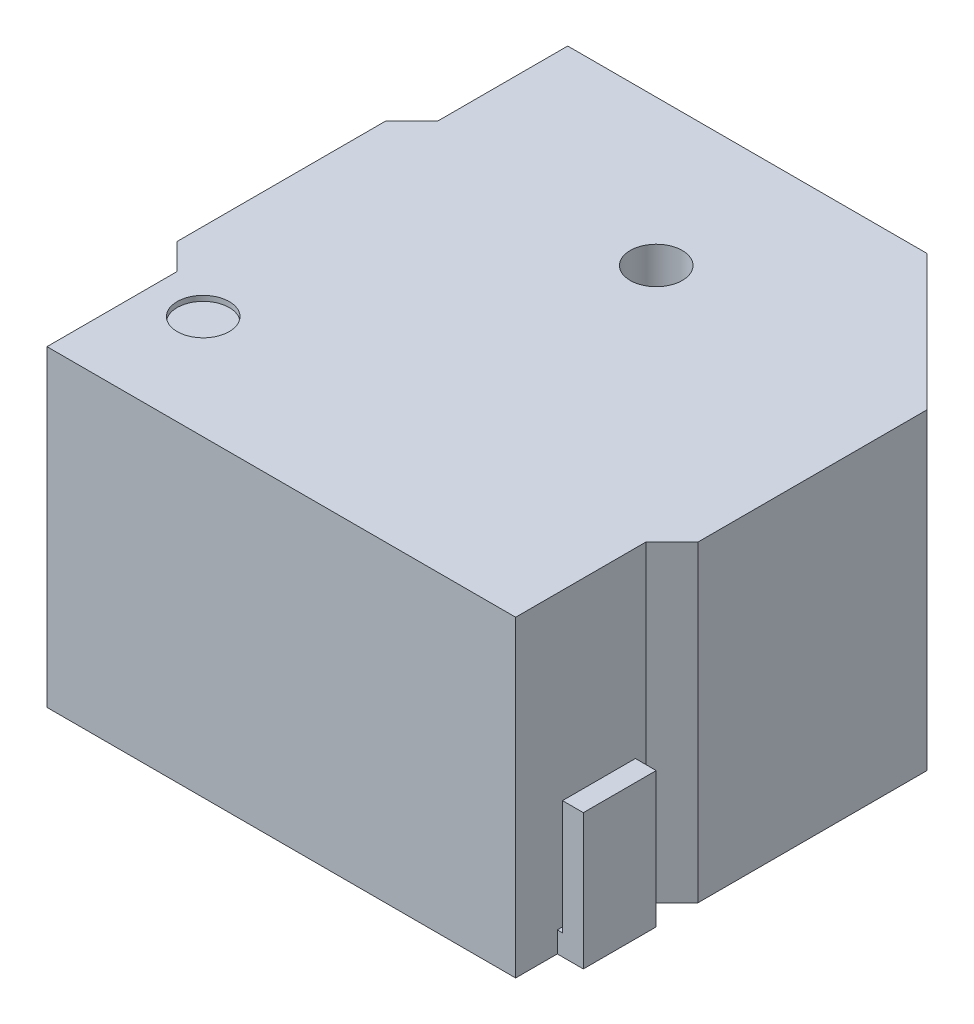
ISO-10303-21;
HEADER;
FILE_DESCRIPTION(('STEP AP214'),'2;1');
FILE_NAME('part.step','',(''),(''),'','','');
FILE_SCHEMA(('AUTOMOTIVE_DESIGN { 1 0 10303 214 1 1 1 1 }'));
ENDSEC;
DATA;
#1=APPLICATION_CONTEXT('core data for automotive mechanical design processes');
#2=APPLICATION_PROTOCOL_DEFINITION('international standard','automotive_design',2000,#1);
#3=PRODUCT_CONTEXT('',#1,'mechanical');
#4=PRODUCT('Part','Part','',(#3));
#5=PRODUCT_RELATED_PRODUCT_CATEGORY('part','',(#4));
#6=PRODUCT_DEFINITION_FORMATION('','',#4);
#7=PRODUCT_DEFINITION_CONTEXT('part definition',#1,'design');
#8=PRODUCT_DEFINITION('design','',#6,#7);
#9=PRODUCT_DEFINITION_SHAPE('','',#8);
#10=(LENGTH_UNIT() NAMED_UNIT(*) SI_UNIT(.MILLI.,.METRE.));
#11=(NAMED_UNIT(*) PLANE_ANGLE_UNIT() SI_UNIT($,.RADIAN.));
#12=(NAMED_UNIT(*) SI_UNIT($,.STERADIAN.) SOLID_ANGLE_UNIT());
#13=UNCERTAINTY_MEASURE_WITH_UNIT(LENGTH_MEASURE(1.E-05),#10,'distance_accuracy_value','');
#14=(GEOMETRIC_REPRESENTATION_CONTEXT(3) GLOBAL_UNCERTAINTY_ASSIGNED_CONTEXT((#13)) GLOBAL_UNIT_ASSIGNED_CONTEXT((#10,
#11,#12)) REPRESENTATION_CONTEXT('',''));
#15=CARTESIAN_POINT('',(0.,0.,0.));
#16=DIRECTION('',(0.,0.,1.));
#17=DIRECTION('',(1.,0.,0.));
#18=AXIS2_PLACEMENT_3D('',#15,#16,#17);
#19=CARTESIAN_POINT('',(0.,0.2,0.));
#20=DIRECTION('',(0.,-1.,0.));
#21=DIRECTION('',(0.,0.,-1.));
#22=AXIS2_PLACEMENT_3D('',#19,#20,#21);
#23=PLANE('',#22);
#24=DIRECTION('',(0.,0.,1.));
#25=VECTOR('',#24,1.);
#26=CARTESIAN_POINT('',(2.3,0.2,1.4));
#27=LINE('',#26,#25);
#28=CARTESIAN_POINT('',(2.3,0.2,1.4));
#29=VERTEX_POINT('',#28);
#30=CARTESIAN_POINT('',(2.3,0.2,2.1));
#31=VERTEX_POINT('',#30);
#32=EDGE_CURVE('E266',#29,#31,#27,.T.);
#33=ORIENTED_EDGE('',*,*,#32,.F.);
#34=DIRECTION('',(1.,0.,0.));
#35=VECTOR('',#34,1.);
#36=CARTESIAN_POINT('',(1.4,0.2,1.4));
#37=LINE('',#36,#35);
#38=CARTESIAN_POINT('',(2.25,0.2,1.4));
#39=VERTEX_POINT('',#38);
#40=EDGE_CURVE('E310',#39,#29,#37,.T.);
#41=ORIENTED_EDGE('',*,*,#40,.F.);
#42=DIRECTION('',(0.,0.,1.));
#43=VECTOR('',#42,1.);
#44=CARTESIAN_POINT('',(2.25,0.2,2.5));
#45=LINE('',#44,#43);
#46=CARTESIAN_POINT('',(2.25,0.2,2.1));
#47=VERTEX_POINT('',#46);
#48=EDGE_CURVE('E453',#39,#47,#45,.T.);
#49=ORIENTED_EDGE('',*,*,#48,.T.);
#50=DIRECTION('',(-1.,0.,0.));
#51=VECTOR('',#50,1.);
#52=CARTESIAN_POINT('',(2.5,0.2,2.1));
#53=LINE('',#52,#51);
#54=EDGE_CURVE('E316',#31,#47,#53,.T.);
#55=ORIENTED_EDGE('',*,*,#54,.F.);
#56=EDGE_LOOP('',(#33,#41,#49,#55));
#57=FACE_BOUND('',#56,.T.);
#58=ADVANCED_FACE('F34',(#57),#23,.F.);
#59=CARTESIAN_POINT('',(0.,0.2,0.));
#60=DIRECTION('',(0.,-1.,0.));
#61=DIRECTION('',(0.,0.,-1.));
#62=AXIS2_PLACEMENT_3D('',#59,#60,#61);
#63=PLANE('',#62);
#64=DIRECTION('',(0.,0.,-1.));
#65=VECTOR('',#64,1.);
#66=CARTESIAN_POINT('',(-2.3,0.2,1.4));
#67=LINE('',#66,#65);
#68=CARTESIAN_POINT('',(-2.3,0.2,2.1));
#69=VERTEX_POINT('',#68);
#70=CARTESIAN_POINT('',(-2.3,0.2,1.4));
#71=VERTEX_POINT('',#70);
#72=EDGE_CURVE('E276',#69,#71,#67,.T.);
#73=ORIENTED_EDGE('',*,*,#72,.F.);
#74=DIRECTION('',(-1.,0.,0.));
#75=VECTOR('',#74,1.);
#76=CARTESIAN_POINT('',(-1.4,0.2,2.1));
#77=LINE('',#76,#75);
#78=CARTESIAN_POINT('',(-2.25,0.2,2.1));
#79=VERTEX_POINT('',#78);
#80=EDGE_CURVE('E314',#79,#69,#77,.T.);
#81=ORIENTED_EDGE('',*,*,#80,.F.);
#82=DIRECTION('',(0.,0.,-1.));
#83=VECTOR('',#82,1.);
#84=CARTESIAN_POINT('',(-2.25,0.2,1.25));
#85=LINE('',#84,#83);
#86=CARTESIAN_POINT('',(-2.25,0.2,1.4));
#87=VERTEX_POINT('',#86);
#88=EDGE_CURVE('E154',#79,#87,#85,.T.);
#89=ORIENTED_EDGE('',*,*,#88,.T.);
#90=DIRECTION('',(1.,0.,0.));
#91=VECTOR('',#90,1.);
#92=CARTESIAN_POINT('',(-2.5,0.2,1.4));
#93=LINE('',#92,#91);
#94=EDGE_CURVE('E330',#71,#87,#93,.T.);
#95=ORIENTED_EDGE('',*,*,#94,.F.);
#96=EDGE_LOOP('',(#73,#81,#89,#95));
#97=FACE_BOUND('',#96,.T.);
#98=ADVANCED_FACE('F504',(#97),#63,.F.);
#99=CARTESIAN_POINT('',(0.,0.2,0.));
#100=DIRECTION('',(0.,-1.,0.));
#101=DIRECTION('',(0.,0.,-1.));
#102=AXIS2_PLACEMENT_3D('',#99,#100,#101);
#103=PLANE('',#102);
#104=DIRECTION('',(0.,0.,-1.));
#105=VECTOR('',#104,1.);
#106=CARTESIAN_POINT('',(-2.3,0.2,-2.1));
#107=LINE('',#106,#105);
#108=CARTESIAN_POINT('',(-2.3,0.2,-1.4));
#109=VERTEX_POINT('',#108);
#110=CARTESIAN_POINT('',(-2.3,0.2,-2.1));
#111=VERTEX_POINT('',#110);
#112=EDGE_CURVE('E293',#109,#111,#107,.T.);
#113=ORIENTED_EDGE('',*,*,#112,.F.);
#114=DIRECTION('',(-1.,0.,0.));
#115=VECTOR('',#114,1.);
#116=CARTESIAN_POINT('',(-1.4,0.2,-1.4));
#117=LINE('',#116,#115);
#118=CARTESIAN_POINT('',(-2.25,0.2,-1.4));
#119=VERTEX_POINT('',#118);
#120=EDGE_CURVE('E327',#119,#109,#117,.T.);
#121=ORIENTED_EDGE('',*,*,#120,.F.);
#122=DIRECTION('',(0.,0.,-1.));
#123=VECTOR('',#122,1.);
#124=CARTESIAN_POINT('',(-2.25,0.2,-2.5));
#125=LINE('',#124,#123);
#126=CARTESIAN_POINT('',(-2.25,0.2,-2.1));
#127=VERTEX_POINT('',#126);
#128=EDGE_CURVE('E437',#119,#127,#125,.T.);
#129=ORIENTED_EDGE('',*,*,#128,.T.);
#130=DIRECTION('',(1.,0.,0.));
#131=VECTOR('',#130,1.);
#132=CARTESIAN_POINT('',(-2.5,0.2,-2.1));
#133=LINE('',#132,#131);
#134=EDGE_CURVE('E343',#111,#127,#133,.T.);
#135=ORIENTED_EDGE('',*,*,#134,.F.);
#136=EDGE_LOOP('',(#113,#121,#129,#135));
#137=FACE_BOUND('',#136,.T.);
#138=ADVANCED_FACE('F510',(#137),#103,.F.);
#139=CARTESIAN_POINT('',(-1.,0.3,-1.75));
#140=DIRECTION('',(0.,-1.,0.));
#141=DIRECTION('',(0.,0.,-1.));
#142=AXIS2_PLACEMENT_3D('',#139,#140,#141);
#143=PLANE('',#142);
#144=CARTESIAN_POINT('',(-1.,0.3,-1.75));
#145=DIRECTION('',(0.,-1.,0.));
#146=DIRECTION('',(0.,0.,-1.));
#147=AXIS2_PLACEMENT_3D('',#144,#145,#146);
#148=CIRCLE('',#147,0.3);
#149=CARTESIAN_POINT('',(-1.,0.3,-2.05));
#150=VERTEX_POINT('',#149);
#151=EDGE_CURVE('E38',#150,#150,#148,.T.);
#152=ORIENTED_EDGE('',*,*,#151,.T.);
#153=EDGE_LOOP('',(#152));
#154=FACE_BOUND('',#153,.T.);
#155=ADVANCED_FACE('F36',(#154),#143,.T.);
#156=CARTESIAN_POINT('',(-1.,0.3,1.75));
#157=DIRECTION('',(0.,-1.,0.));
#158=DIRECTION('',(0.,0.,-1.));
#159=AXIS2_PLACEMENT_3D('',#156,#157,#158);
#160=PLANE('',#159);
#161=CARTESIAN_POINT('',(-1.,0.3,1.75));
#162=DIRECTION('',(0.,-1.,0.));
#163=DIRECTION('',(0.,0.,-1.));
#164=AXIS2_PLACEMENT_3D('',#161,#162,#163);
#165=CIRCLE('',#164,0.3);
#166=CARTESIAN_POINT('',(-1.,0.3,1.45));
#167=VERTEX_POINT('',#166);
#168=EDGE_CURVE('E479',#167,#167,#165,.T.);
#169=ORIENTED_EDGE('',*,*,#168,.T.);
#170=EDGE_LOOP('',(#169));
#171=FACE_BOUND('',#170,.T.);
#172=ADVANCED_FACE('F500',(#171),#160,.T.);
#173=CARTESIAN_POINT('',(1.,0.3,1.75));
#174=DIRECTION('',(0.,-1.,0.));
#175=DIRECTION('',(0.,0.,-1.));
#176=AXIS2_PLACEMENT_3D('',#173,#174,#175);
#177=PLANE('',#176);
#178=CARTESIAN_POINT('',(1.,0.3,1.75));
#179=DIRECTION('',(0.,-1.,0.));
#180=DIRECTION('',(0.,0.,-1.));
#181=AXIS2_PLACEMENT_3D('',#178,#179,#180);
#182=CIRCLE('',#181,0.3);
#183=CARTESIAN_POINT('',(1.,0.3,1.45));
#184=VERTEX_POINT('',#183);
#185=EDGE_CURVE('E463',#184,#184,#182,.T.);
#186=ORIENTED_EDGE('',*,*,#185,.T.);
#187=EDGE_LOOP('',(#186));
#188=FACE_BOUND('',#187,.T.);
#189=ADVANCED_FACE('F490',(#188),#177,.T.);
#190=CARTESIAN_POINT('',(-1.,0.3,-1.75));
#191=DIRECTION('',(0.,-1.,0.));
#192=DIRECTION('',(0.,0.,-1.));
#193=AXIS2_PLACEMENT_3D('',#190,#191,#192);
#194=CYLINDRICAL_SURFACE('',#193,0.3);
#195=CARTESIAN_POINT('',(-1.,0.,-1.75));
#196=DIRECTION('',(0.,-1.,0.));
#197=DIRECTION('',(0.,0.,-1.));
#198=AXIS2_PLACEMENT_3D('',#195,#196,#197);
#199=CIRCLE('',#198,0.3);
#200=CARTESIAN_POINT('',(-1.,0.,-2.05));
#201=VERTEX_POINT('',#200);
#202=EDGE_CURVE('E417',#201,#201,#199,.T.);
#203=ORIENTED_EDGE('',*,*,#202,.T.);
#204=EDGE_LOOP('',(#203));
#205=FACE_BOUND('',#204,.T.);
#206=ORIENTED_EDGE('',*,*,#151,.F.);
#207=EDGE_LOOP('',(#206));
#208=FACE_BOUND('',#207,.T.);
#209=ADVANCED_FACE('F487',(#205,#208),#194,.F.);
#210=CARTESIAN_POINT('',(-1.,0.3,1.75));
#211=DIRECTION('',(0.,-1.,0.));
#212=DIRECTION('',(0.,0.,-1.));
#213=AXIS2_PLACEMENT_3D('',#210,#211,#212);
#214=CYLINDRICAL_SURFACE('',#213,0.3);
#215=CARTESIAN_POINT('',(-1.,0.,1.75));
#216=DIRECTION('',(0.,-1.,0.));
#217=DIRECTION('',(0.,0.,-1.));
#218=AXIS2_PLACEMENT_3D('',#215,#216,#217);
#219=CIRCLE('',#218,0.3);
#220=CARTESIAN_POINT('',(-1.,0.,1.45));
#221=VERTEX_POINT('',#220);
#222=EDGE_CURVE('E473',#221,#221,#219,.T.);
#223=ORIENTED_EDGE('',*,*,#222,.T.);
#224=EDGE_LOOP('',(#223));
#225=FACE_BOUND('',#224,.T.);
#226=ORIENTED_EDGE('',*,*,#168,.F.);
#227=EDGE_LOOP('',(#226));
#228=FACE_BOUND('',#227,.T.);
#229=ADVANCED_FACE('F489',(#225,#228),#214,.F.);
#230=CARTESIAN_POINT('',(1.,0.3,1.75));
#231=DIRECTION('',(0.,-1.,0.));
#232=DIRECTION('',(0.,0.,-1.));
#233=AXIS2_PLACEMENT_3D('',#230,#231,#232);
#234=CYLINDRICAL_SURFACE('',#233,0.3);
#235=CARTESIAN_POINT('',(1.,0.,1.75));
#236=DIRECTION('',(0.,-1.,0.));
#237=DIRECTION('',(0.,0.,-1.));
#238=AXIS2_PLACEMENT_3D('',#235,#236,#237);
#239=CIRCLE('',#238,0.3);
#240=CARTESIAN_POINT('',(1.,0.,1.45));
#241=VERTEX_POINT('',#240);
#242=EDGE_CURVE('E414',#241,#241,#239,.T.);
#243=ORIENTED_EDGE('',*,*,#242,.T.);
#244=EDGE_LOOP('',(#243));
#245=FACE_BOUND('',#244,.T.);
#246=ORIENTED_EDGE('',*,*,#185,.F.);
#247=EDGE_LOOP('',(#246));
#248=FACE_BOUND('',#247,.T.);
#249=ADVANCED_FACE('F497',(#245,#248),#234,.F.);
#250=CARTESIAN_POINT('',(-2.25,3.,1.25));
#251=DIRECTION('',(1.,0.,0.));
#252=DIRECTION('',(0.,0.,-1.));
#253=AXIS2_PLACEMENT_3D('',#250,#251,#252);
#254=PLANE('',#253);
#255=DIRECTION('',(0.,0.,1.));
#256=VECTOR('',#255,1.);
#257=CARTESIAN_POINT('',(-2.25,0.,3.5));
#258=LINE('',#257,#256);
#259=CARTESIAN_POINT('',(-2.25,0.,2.1));
#260=VERTEX_POINT('',#259);
#261=CARTESIAN_POINT('',(-2.25,0.,2.5));
#262=VERTEX_POINT('',#261);
#263=EDGE_CURVE('E424',#260,#262,#258,.T.);
#264=ORIENTED_EDGE('',*,*,#263,.T.);
#265=DIRECTION('',(0.,1.,0.));
#266=VECTOR('',#265,1.);
#267=CARTESIAN_POINT('',(-2.25,3.,2.5));
#268=LINE('',#267,#266);
#269=CARTESIAN_POINT('',(-2.25,3.,2.5));
#270=VERTEX_POINT('',#269);
#271=EDGE_CURVE('E394',#262,#270,#268,.T.);
#272=ORIENTED_EDGE('',*,*,#271,.T.);
#273=DIRECTION('',(0.,0.,-1.));
#274=VECTOR('',#273,1.);
#275=CARTESIAN_POINT('',(-2.25,3.,1.25));
#276=LINE('',#275,#274);
#277=CARTESIAN_POINT('',(-2.25,3.,1.25));
#278=VERTEX_POINT('',#277);
#279=EDGE_CURVE('E458',#278,#270,#276,.F.);
#280=ORIENTED_EDGE('',*,*,#279,.F.);
#281=DIRECTION('',(0.,1.,0.));
#282=VECTOR('',#281,1.);
#283=CARTESIAN_POINT('',(-2.25,3.,1.25));
#284=LINE('',#283,#282);
#285=CARTESIAN_POINT('',(-2.25,0.,1.25));
#286=VERTEX_POINT('',#285);
#287=EDGE_CURVE('E400',#278,#286,#284,.F.);
#288=ORIENTED_EDGE('',*,*,#287,.T.);
#289=DIRECTION('',(0.,0.,1.));
#290=VECTOR('',#289,1.);
#291=CARTESIAN_POINT('',(-2.25,0.,3.5));
#292=LINE('',#291,#290);
#293=CARTESIAN_POINT('',(-2.25,0.,1.4));
#294=VERTEX_POINT('',#293);
#295=EDGE_CURVE('E426',#286,#294,#292,.T.);
#296=ORIENTED_EDGE('',*,*,#295,.T.);
#297=DIRECTION('',(0.,1.,0.));
#298=VECTOR('',#297,1.);
#299=CARTESIAN_POINT('',(-2.25,3.,1.4));
#300=LINE('',#299,#298);
#301=EDGE_CURVE('E460',#87,#294,#300,.F.);
#302=ORIENTED_EDGE('',*,*,#301,.F.);
#303=ORIENTED_EDGE('',*,*,#88,.F.);
#304=DIRECTION('',(0.,1.,0.));
#305=VECTOR('',#304,1.);
#306=CARTESIAN_POINT('',(-2.25,3.,2.1));
#307=LINE('',#306,#305);
#308=EDGE_CURVE('E456',#260,#79,#307,.T.);
#309=ORIENTED_EDGE('',*,*,#308,.F.);
#310=EDGE_LOOP('',(#264,#272,#280,#288,#296,#302,#303,#309));
#311=FACE_BOUND('',#310,.T.);
#312=ADVANCED_FACE('F613',(#311),#254,.F.);
#313=CARTESIAN_POINT('',(2.25,3.,2.5));
#314=DIRECTION('',(-1.,0.,0.));
#315=DIRECTION('',(0.,0.,1.));
#316=AXIS2_PLACEMENT_3D('',#313,#314,#315);
#317=PLANE('',#316);
#318=DIRECTION('',(0.,0.,1.));
#319=VECTOR('',#318,1.);
#320=CARTESIAN_POINT('',(2.25,0.,3.5));
#321=LINE('',#320,#319);
#322=CARTESIAN_POINT('',(2.25,0.,1.4));
#323=VERTEX_POINT('',#322);
#324=CARTESIAN_POINT('',(2.25,0.,1.25));
#325=VERTEX_POINT('',#324);
#326=EDGE_CURVE('E420',#323,#325,#321,.F.);
#327=ORIENTED_EDGE('',*,*,#326,.T.);
#328=DIRECTION('',(0.,1.,0.));
#329=VECTOR('',#328,1.);
#330=CARTESIAN_POINT('',(2.25,3.,1.25));
#331=LINE('',#330,#329);
#332=CARTESIAN_POINT('',(2.25,3.,1.25));
#333=VERTEX_POINT('',#332);
#334=EDGE_CURVE('E442',#325,#333,#331,.T.);
#335=ORIENTED_EDGE('',*,*,#334,.T.);
#336=DIRECTION('',(0.,0.,1.));
#337=VECTOR('',#336,1.);
#338=CARTESIAN_POINT('',(2.25,3.,2.5));
#339=LINE('',#338,#337);
#340=CARTESIAN_POINT('',(2.25,3.,2.5));
#341=VERTEX_POINT('',#340);
#342=EDGE_CURVE('E448',#341,#333,#339,.F.);
#343=ORIENTED_EDGE('',*,*,#342,.F.);
#344=DIRECTION('',(0.,1.,0.));
#345=VECTOR('',#344,1.);
#346=CARTESIAN_POINT('',(2.25,3.,2.5));
#347=LINE('',#346,#345);
#348=CARTESIAN_POINT('',(2.25,0.,2.5));
#349=VERTEX_POINT('',#348);
#350=EDGE_CURVE('E391',#341,#349,#347,.F.);
#351=ORIENTED_EDGE('',*,*,#350,.T.);
#352=DIRECTION('',(0.,0.,1.));
#353=VECTOR('',#352,1.);
#354=CARTESIAN_POINT('',(2.25,0.,3.5));
#355=LINE('',#354,#353);
#356=CARTESIAN_POINT('',(2.25,0.,2.1));
#357=VERTEX_POINT('',#356);
#358=EDGE_CURVE('E422',#349,#357,#355,.F.);
#359=ORIENTED_EDGE('',*,*,#358,.T.);
#360=DIRECTION('',(0.,1.,0.));
#361=VECTOR('',#360,1.);
#362=CARTESIAN_POINT('',(2.25,3.,2.1));
#363=LINE('',#362,#361);
#364=EDGE_CURVE('E450',#47,#357,#363,.F.);
#365=ORIENTED_EDGE('',*,*,#364,.F.);
#366=ORIENTED_EDGE('',*,*,#48,.F.);
#367=DIRECTION('',(0.,1.,0.));
#368=VECTOR('',#367,1.);
#369=CARTESIAN_POINT('',(2.25,3.,1.4));
#370=LINE('',#369,#368);
#371=EDGE_CURVE('E445',#323,#39,#370,.T.);
#372=ORIENTED_EDGE('',*,*,#371,.F.);
#373=EDGE_LOOP('',(#327,#335,#343,#351,#359,#365,#366,#372));
#374=FACE_BOUND('',#373,.T.);
#375=ADVANCED_FACE('F609',(#374),#317,.F.);
#376=CARTESIAN_POINT('',(2.25,3.,1.25));
#377=DIRECTION('',(-0.707106781186548,0.,-0.707106781186548));
#378=DIRECTION('',(-0.707106781186548,0.,0.707106781186548));
#379=AXIS2_PLACEMENT_3D('',#376,#377,#378);
#380=PLANE('',#379);
#381=DIRECTION('',(-0.707106781186548,0.,0.707106781186548));
#382=VECTOR('',#381,1.);
#383=CARTESIAN_POINT('',(2.25,3.,1.25));
#384=LINE('',#383,#382);
#385=CARTESIAN_POINT('',(2.5,3.,1.));
#386=VERTEX_POINT('',#385);
#387=EDGE_CURVE('E440',#333,#386,#384,.F.);
#388=ORIENTED_EDGE('',*,*,#387,.F.);
#389=ORIENTED_EDGE('',*,*,#334,.F.);
#390=DIRECTION('',(0.707106781186548,0.,-0.707106781186548));
#391=VECTOR('',#390,1.);
#392=CARTESIAN_POINT('',(2.25,0.,1.25));
#393=LINE('',#392,#391);
#394=CARTESIAN_POINT('',(2.5,0.,1.));
#395=VERTEX_POINT('',#394);
#396=EDGE_CURVE('E418',#325,#395,#393,.T.);
#397=ORIENTED_EDGE('',*,*,#396,.T.);
#398=DIRECTION('',(0.,1.,0.));
#399=VECTOR('',#398,1.);
#400=CARTESIAN_POINT('',(2.5,3.,1.));
#401=LINE('',#400,#399);
#402=EDGE_CURVE('E385',#395,#386,#401,.T.);
#403=ORIENTED_EDGE('',*,*,#402,.T.);
#404=EDGE_LOOP('',(#388,#389,#397,#403));
#405=FACE_BOUND('',#404,.T.);
#406=ADVANCED_FACE('F605',(#405),#380,.F.);
#407=CARTESIAN_POINT('',(-2.25,3.,-2.5));
#408=DIRECTION('',(1.,0.,0.));
#409=DIRECTION('',(0.,0.,-1.));
#410=AXIS2_PLACEMENT_3D('',#407,#408,#409);
#411=PLANE('',#410);
#412=DIRECTION('',(0.,0.,1.));
#413=VECTOR('',#412,1.);
#414=CARTESIAN_POINT('',(-2.25,0.,3.5));
#415=LINE('',#414,#413);
#416=CARTESIAN_POINT('',(-2.25,0.,-1.4));
#417=VERTEX_POINT('',#416);
#418=CARTESIAN_POINT('',(-2.25,0.,-1.25));
#419=VERTEX_POINT('',#418);
#420=EDGE_CURVE('E428',#417,#419,#415,.T.);
#421=ORIENTED_EDGE('',*,*,#420,.T.);
#422=DIRECTION('',(0.,1.,0.));
#423=VECTOR('',#422,1.);
#424=CARTESIAN_POINT('',(-2.25,3.,-1.25));
#425=LINE('',#424,#423);
#426=CARTESIAN_POINT('',(-2.25,3.,-1.25));
#427=VERTEX_POINT('',#426);
#428=EDGE_CURVE('E408',#419,#427,#425,.T.);
#429=ORIENTED_EDGE('',*,*,#428,.T.);
#430=DIRECTION('',(0.,0.,-1.));
#431=VECTOR('',#430,1.);
#432=CARTESIAN_POINT('',(-2.25,3.,-2.5));
#433=LINE('',#432,#431);
#434=CARTESIAN_POINT('',(-2.25,3.,-2.5));
#435=VERTEX_POINT('',#434);
#436=EDGE_CURVE('E433',#435,#427,#433,.F.);
#437=ORIENTED_EDGE('',*,*,#436,.F.);
#438=DIRECTION('',(0.,1.,0.));
#439=VECTOR('',#438,1.);
#440=CARTESIAN_POINT('',(-2.25,3.,-2.5));
#441=LINE('',#440,#439);
#442=CARTESIAN_POINT('',(-2.25,0.,-2.5));
#443=VERTEX_POINT('',#442);
#444=EDGE_CURVE('E374',#435,#443,#441,.F.);
#445=ORIENTED_EDGE('',*,*,#444,.T.);
#446=DIRECTION('',(0.,0.,1.));
#447=VECTOR('',#446,1.);
#448=CARTESIAN_POINT('',(-2.25,0.,3.5));
#449=LINE('',#448,#447);
#450=CARTESIAN_POINT('',(-2.25,0.,-2.1));
#451=VERTEX_POINT('',#450);
#452=EDGE_CURVE('E415',#443,#451,#449,.T.);
#453=ORIENTED_EDGE('',*,*,#452,.T.);
#454=DIRECTION('',(0.,1.,0.));
#455=VECTOR('',#454,1.);
#456=CARTESIAN_POINT('',(-2.25,3.,-2.1));
#457=LINE('',#456,#455);
#458=EDGE_CURVE('E435',#127,#451,#457,.F.);
#459=ORIENTED_EDGE('',*,*,#458,.F.);
#460=ORIENTED_EDGE('',*,*,#128,.F.);
#461=DIRECTION('',(0.,1.,0.));
#462=VECTOR('',#461,1.);
#463=CARTESIAN_POINT('',(-2.25,3.,-1.4));
#464=LINE('',#463,#462);
#465=EDGE_CURVE('E430',#417,#119,#464,.T.);
#466=ORIENTED_EDGE('',*,*,#465,.F.);
#467=EDGE_LOOP('',(#421,#429,#437,#445,#453,#459,#460,#466));
#468=FACE_BOUND('',#467,.T.);
#469=ADVANCED_FACE('F602',(#468),#411,.F.);
#470=CARTESIAN_POINT('',(0.,0.,3.5));
#471=DIRECTION('',(0.,1.,0.));
#472=DIRECTION('',(0.,0.,1.));
#473=AXIS2_PLACEMENT_3D('',#470,#471,#472);
#474=PLANE('',#473);
#475=ORIENTED_EDGE('',*,*,#326,.F.);
#476=DIRECTION('',(-1.,0.,0.));
#477=VECTOR('',#476,1.);
#478=CARTESIAN_POINT('',(1.4,0.,1.4));
#479=LINE('',#478,#477);
#480=CARTESIAN_POINT('',(2.5,0.,1.4));
#481=VERTEX_POINT('',#480);
#482=EDGE_CURVE('E312',#481,#323,#479,.T.);
#483=ORIENTED_EDGE('',*,*,#482,.F.);
#484=DIRECTION('',(0.,0.,-1.));
#485=VECTOR('',#484,1.);
#486=CARTESIAN_POINT('',(2.5,0.,1.4));
#487=LINE('',#486,#485);
#488=CARTESIAN_POINT('',(2.5,0.,2.1));
#489=VERTEX_POINT('',#488);
#490=EDGE_CURVE('E247',#489,#481,#487,.T.);
#491=ORIENTED_EDGE('',*,*,#490,.F.);
#492=DIRECTION('',(1.,0.,0.));
#493=VECTOR('',#492,1.);
#494=CARTESIAN_POINT('',(2.5,0.,2.1));
#495=LINE('',#494,#493);
#496=EDGE_CURVE('E250',#357,#489,#495,.T.);
#497=ORIENTED_EDGE('',*,*,#496,.F.);
#498=ORIENTED_EDGE('',*,*,#358,.F.);
#499=DIRECTION('',(-1.,0.,0.));
#500=VECTOR('',#499,1.);
#501=CARTESIAN_POINT('',(-2.25,0.,2.5));
#502=LINE('',#501,#500);
#503=EDGE_CURVE('E397',#349,#262,#502,.T.);
#504=ORIENTED_EDGE('',*,*,#503,.T.);
#505=ORIENTED_EDGE('',*,*,#263,.F.);
#506=DIRECTION('',(1.,0.,0.));
#507=VECTOR('',#506,1.);
#508=CARTESIAN_POINT('',(-1.4,0.,2.1));
#509=LINE('',#508,#507);
#510=CARTESIAN_POINT('',(-2.5,0.,2.1));
#511=VERTEX_POINT('',#510);
#512=EDGE_CURVE('E323',#511,#260,#509,.T.);
#513=ORIENTED_EDGE('',*,*,#512,.F.);
#514=DIRECTION('',(0.,0.,1.));
#515=VECTOR('',#514,1.);
#516=CARTESIAN_POINT('',(-2.5,0.,2.1));
#517=LINE('',#516,#515);
#518=CARTESIAN_POINT('',(-2.5,0.,1.4));
#519=VERTEX_POINT('',#518);
#520=EDGE_CURVE('E320',#519,#511,#517,.T.);
#521=ORIENTED_EDGE('',*,*,#520,.F.);
#522=DIRECTION('',(-1.,0.,0.));
#523=VECTOR('',#522,1.);
#524=CARTESIAN_POINT('',(-2.5,0.,1.4));
#525=LINE('',#524,#523);
#526=EDGE_CURVE('E324',#294,#519,#525,.T.);
#527=ORIENTED_EDGE('',*,*,#526,.F.);
#528=ORIENTED_EDGE('',*,*,#295,.F.);
#529=DIRECTION('',(-0.707106781186548,0.,-0.707106781186548));
#530=VECTOR('',#529,1.);
#531=CARTESIAN_POINT('',(-2.5,0.,1.));
#532=LINE('',#531,#530);
#533=CARTESIAN_POINT('',(-2.5,0.,1.));
#534=VERTEX_POINT('',#533);
#535=EDGE_CURVE('E404',#286,#534,#532,.T.);
#536=ORIENTED_EDGE('',*,*,#535,.T.);
#537=DIRECTION('',(0.,0.,-1.));
#538=VECTOR('',#537,1.);
#539=CARTESIAN_POINT('',(-2.5,0.,-1.));
#540=LINE('',#539,#538);
#541=CARTESIAN_POINT('',(-2.5,0.,-1.));
#542=VERTEX_POINT('',#541);
#543=EDGE_CURVE('E372',#534,#542,#540,.T.);
#544=ORIENTED_EDGE('',*,*,#543,.T.);
#545=DIRECTION('',(0.707106781186548,0.,-0.707106781186548));
#546=VECTOR('',#545,1.);
#547=CARTESIAN_POINT('',(-2.25,0.,-1.25));
#548=LINE('',#547,#546);
#549=EDGE_CURVE('E411',#542,#419,#548,.T.);
#550=ORIENTED_EDGE('',*,*,#549,.T.);
#551=ORIENTED_EDGE('',*,*,#420,.F.);
#552=DIRECTION('',(1.,0.,0.));
#553=VECTOR('',#552,1.);
#554=CARTESIAN_POINT('',(-1.4,0.,-1.4));
#555=LINE('',#554,#553);
#556=CARTESIAN_POINT('',(-2.5,0.,-1.4));
#557=VERTEX_POINT('',#556);
#558=EDGE_CURVE('E163',#557,#417,#555,.T.);
#559=ORIENTED_EDGE('',*,*,#558,.F.);
#560=DIRECTION('',(0.,0.,1.));
#561=VECTOR('',#560,1.);
#562=CARTESIAN_POINT('',(-2.5,0.,-1.4));
#563=LINE('',#562,#561);
#564=CARTESIAN_POINT('',(-2.5,0.,-2.1));
#565=VERTEX_POINT('',#564);
#566=EDGE_CURVE('E337',#565,#557,#563,.T.);
#567=ORIENTED_EDGE('',*,*,#566,.F.);
#568=DIRECTION('',(-1.,0.,0.));
#569=VECTOR('',#568,1.);
#570=CARTESIAN_POINT('',(-2.5,0.,-2.1));
#571=LINE('',#570,#569);
#572=EDGE_CURVE('E171',#451,#565,#571,.T.);
#573=ORIENTED_EDGE('',*,*,#572,.F.);
#574=ORIENTED_EDGE('',*,*,#452,.F.);
#575=DIRECTION('',(1.,0.,0.));
#576=VECTOR('',#575,1.);
#577=CARTESIAN_POINT('',(1.2,0.,-2.5));
#578=LINE('',#577,#576);
#579=CARTESIAN_POINT('',(1.2,0.,-2.5));
#580=VERTEX_POINT('',#579);
#581=EDGE_CURVE('E379',#443,#580,#578,.T.);
#582=ORIENTED_EDGE('',*,*,#581,.T.);
#583=DIRECTION('',(0.707106781186548,0.,0.707106781186548));
#584=VECTOR('',#583,1.);
#585=CARTESIAN_POINT('',(2.5,0.,-1.2));
#586=LINE('',#585,#584);
#587=CARTESIAN_POINT('',(2.5,0.,-1.2));
#588=VERTEX_POINT('',#587);
#589=EDGE_CURVE('E383',#580,#588,#586,.T.);
#590=ORIENTED_EDGE('',*,*,#589,.T.);
#591=DIRECTION('',(0.,0.,1.));
#592=VECTOR('',#591,1.);
#593=CARTESIAN_POINT('',(2.5,0.,1.));
#594=LINE('',#593,#592);
#595=EDGE_CURVE('E388',#588,#395,#594,.T.);
#596=ORIENTED_EDGE('',*,*,#595,.T.);
#597=ORIENTED_EDGE('',*,*,#396,.F.);
#598=EDGE_LOOP('',(#475,#483,#491,#497,#498,#504,#505,#513,#521,#527,#528,#536,#544,#550,#551,
#559,#567,#573,#574,#582,#590,#596,#597));
#599=FACE_BOUND('',#598,.T.);
#600=ORIENTED_EDGE('',*,*,#242,.F.);
#601=EDGE_LOOP('',(#600));
#602=FACE_BOUND('',#601,.T.);
#603=ORIENTED_EDGE('',*,*,#222,.F.);
#604=EDGE_LOOP('',(#603));
#605=FACE_BOUND('',#604,.T.);
#606=ORIENTED_EDGE('',*,*,#202,.F.);
#607=EDGE_LOOP('',(#606));
#608=FACE_BOUND('',#607,.T.);
#609=ADVANCED_FACE('F598',(#599,#602,#605,#608),#474,.F.);
#610=CARTESIAN_POINT('',(-2.25,3.,-1.25));
#611=DIRECTION('',(0.707106781186548,0.,0.707106781186548));
#612=DIRECTION('',(0.707106781186548,0.,-0.707106781186548));
#613=AXIS2_PLACEMENT_3D('',#610,#611,#612);
#614=PLANE('',#613);
#615=DIRECTION('',(0.707106781186548,0.,-0.707106781186548));
#616=VECTOR('',#615,1.);
#617=CARTESIAN_POINT('',(-2.25,3.,-1.25));
#618=LINE('',#617,#616);
#619=CARTESIAN_POINT('',(-2.5,3.,-1.));
#620=VERTEX_POINT('',#619);
#621=EDGE_CURVE('E406',#427,#620,#618,.F.);
#622=ORIENTED_EDGE('',*,*,#621,.F.);
#623=ORIENTED_EDGE('',*,*,#428,.F.);
#624=ORIENTED_EDGE('',*,*,#549,.F.);
#625=DIRECTION('',(0.,1.,0.));
#626=VECTOR('',#625,1.);
#627=CARTESIAN_POINT('',(-2.5,3.,-1.));
#628=LINE('',#627,#626);
#629=EDGE_CURVE('E369',#542,#620,#628,.T.);
#630=ORIENTED_EDGE('',*,*,#629,.T.);
#631=EDGE_LOOP('',(#622,#623,#624,#630));
#632=FACE_BOUND('',#631,.T.);
#633=ADVANCED_FACE('F595',(#632),#614,.F.);
#634=CARTESIAN_POINT('',(-2.5,3.,1.));
#635=DIRECTION('',(0.707106781186548,0.,-0.707106781186548));
#636=DIRECTION('',(-0.707106781186548,0.,-0.707106781186548));
#637=AXIS2_PLACEMENT_3D('',#634,#635,#636);
#638=PLANE('',#637);
#639=DIRECTION('',(-0.707106781186548,0.,-0.707106781186548));
#640=VECTOR('',#639,1.);
#641=CARTESIAN_POINT('',(-2.5,3.,1.));
#642=LINE('',#641,#640);
#643=CARTESIAN_POINT('',(-2.5,3.,1.));
#644=VERTEX_POINT('',#643);
#645=EDGE_CURVE('E53',#644,#278,#642,.F.);
#646=ORIENTED_EDGE('',*,*,#645,.F.);
#647=DIRECTION('',(0.,1.,0.));
#648=VECTOR('',#647,1.);
#649=CARTESIAN_POINT('',(-2.5,3.,1.));
#650=LINE('',#649,#648);
#651=EDGE_CURVE('E366',#644,#534,#650,.F.);
#652=ORIENTED_EDGE('',*,*,#651,.T.);
#653=ORIENTED_EDGE('',*,*,#535,.F.);
#654=ORIENTED_EDGE('',*,*,#287,.F.);
#655=EDGE_LOOP('',(#646,#652,#653,#654));
#656=FACE_BOUND('',#655,.T.);
#657=ADVANCED_FACE('F591',(#656),#638,.F.);
#658=CARTESIAN_POINT('',(0.,2.,-1.1));
#659=DIRECTION('',(0.,1.,0.));
#660=DIRECTION('',(0.,0.,1.));
#661=AXIS2_PLACEMENT_3D('',#658,#659,#660);
#662=PLANE('',#661);
#663=CARTESIAN_POINT('',(0.,2.,-1.1));
#664=DIRECTION('',(0.,1.,0.));
#665=DIRECTION('',(0.,0.,1.));
#666=AXIS2_PLACEMENT_3D('',#663,#664,#665);
#667=CIRCLE('',#666,0.25);
#668=CARTESIAN_POINT('',(0.,2.,-0.85));
#669=VERTEX_POINT('',#668);
#670=EDGE_CURVE('E368',#669,#669,#667,.T.);
#671=ORIENTED_EDGE('',*,*,#670,.T.);
#672=EDGE_LOOP('',(#671));
#673=FACE_BOUND('',#672,.T.);
#674=ADVANCED_FACE('F587',(#673),#662,.T.);
#675=CARTESIAN_POINT('',(-1.75,2.95,1.5));
#676=DIRECTION('',(0.,1.,0.));
#677=DIRECTION('',(0.,0.,1.));
#678=AXIS2_PLACEMENT_3D('',#675,#676,#677);
#679=PLANE('',#678);
#680=CARTESIAN_POINT('',(-1.75,2.95,1.5));
#681=DIRECTION('',(0.,1.,0.));
#682=DIRECTION('',(0.,0.,1.));
#683=AXIS2_PLACEMENT_3D('',#680,#681,#682);
#684=CIRCLE('',#683,0.25);
#685=CARTESIAN_POINT('',(-1.75,2.95,1.75));
#686=VERTEX_POINT('',#685);
#687=EDGE_CURVE('E365',#686,#686,#684,.T.);
#688=ORIENTED_EDGE('',*,*,#687,.T.);
#689=EDGE_LOOP('',(#688));
#690=FACE_BOUND('',#689,.T.);
#691=ADVANCED_FACE('F583',(#690),#679,.T.);
#692=CARTESIAN_POINT('',(-2.25,3.,2.5));
#693=DIRECTION('',(0.,0.,-1.));
#694=DIRECTION('',(-1.,0.,0.));
#695=AXIS2_PLACEMENT_3D('',#692,#693,#694);
#696=PLANE('',#695);
#697=DIRECTION('',(1.,0.,0.));
#698=VECTOR('',#697,1.);
#699=CARTESIAN_POINT('',(0.,3.,2.5));
#700=LINE('',#699,#698);
#701=EDGE_CURVE('E362',#270,#341,#700,.T.);
#702=ORIENTED_EDGE('',*,*,#701,.F.);
#703=ORIENTED_EDGE('',*,*,#271,.F.);
#704=ORIENTED_EDGE('',*,*,#503,.F.);
#705=ORIENTED_EDGE('',*,*,#350,.F.);
#706=EDGE_LOOP('',(#702,#703,#704,#705));
#707=FACE_BOUND('',#706,.T.);
#708=ADVANCED_FACE('F579',(#707),#696,.F.);
#709=CARTESIAN_POINT('',(2.5,3.,1.));
#710=DIRECTION('',(-1.,0.,0.));
#711=DIRECTION('',(0.,0.,1.));
#712=AXIS2_PLACEMENT_3D('',#709,#710,#711);
#713=PLANE('',#712);
#714=DIRECTION('',(0.,0.,1.));
#715=VECTOR('',#714,1.);
#716=CARTESIAN_POINT('',(2.5,3.,3.5));
#717=LINE('',#716,#715);
#718=CARTESIAN_POINT('',(2.5,3.,-1.2));
#719=VERTEX_POINT('',#718);
#720=EDGE_CURVE('E359',#386,#719,#717,.F.);
#721=ORIENTED_EDGE('',*,*,#720,.F.);
#722=ORIENTED_EDGE('',*,*,#402,.F.);
#723=ORIENTED_EDGE('',*,*,#595,.F.);
#724=DIRECTION('',(0.,1.,0.));
#725=VECTOR('',#724,1.);
#726=CARTESIAN_POINT('',(2.5,3.,-1.2));
#727=LINE('',#726,#725);
#728=EDGE_CURVE('E381',#588,#719,#727,.T.);
#729=ORIENTED_EDGE('',*,*,#728,.T.);
#730=EDGE_LOOP('',(#721,#722,#723,#729));
#731=FACE_BOUND('',#730,.T.);
#732=ADVANCED_FACE('F575',(#731),#713,.F.);
#733=CARTESIAN_POINT('',(2.5,3.,-1.2));
#734=DIRECTION('',(-0.707106781186548,0.,0.707106781186548));
#735=DIRECTION('',(0.707106781186548,0.,0.707106781186548));
#736=AXIS2_PLACEMENT_3D('',#733,#734,#735);
#737=PLANE('',#736);
#738=DIRECTION('',(-0.707106781186547,0.,-0.707106781186547));
#739=VECTOR('',#738,1.);
#740=CARTESIAN_POINT('',(2.5,3.,-1.2));
#741=LINE('',#740,#739);
#742=CARTESIAN_POINT('',(1.2,3.,-2.5));
#743=VERTEX_POINT('',#742);
#744=EDGE_CURVE('E356',#719,#743,#741,.T.);
#745=ORIENTED_EDGE('',*,*,#744,.F.);
#746=ORIENTED_EDGE('',*,*,#728,.F.);
#747=ORIENTED_EDGE('',*,*,#589,.F.);
#748=DIRECTION('',(0.,1.,0.));
#749=VECTOR('',#748,1.);
#750=CARTESIAN_POINT('',(1.2,3.,-2.5));
#751=LINE('',#750,#749);
#752=EDGE_CURVE('E377',#580,#743,#751,.T.);
#753=ORIENTED_EDGE('',*,*,#752,.T.);
#754=EDGE_LOOP('',(#745,#746,#747,#753));
#755=FACE_BOUND('',#754,.T.);
#756=ADVANCED_FACE('F571',(#755),#737,.F.);
#757=CARTESIAN_POINT('',(1.2,3.,-2.5));
#758=DIRECTION('',(0.,0.,1.));
#759=DIRECTION('',(1.,0.,0.));
#760=AXIS2_PLACEMENT_3D('',#757,#758,#759);
#761=PLANE('',#760);
#762=DIRECTION('',(1.,0.,0.));
#763=VECTOR('',#762,1.);
#764=CARTESIAN_POINT('',(0.,3.,-2.5));
#765=LINE('',#764,#763);
#766=EDGE_CURVE('E353',#743,#435,#765,.F.);
#767=ORIENTED_EDGE('',*,*,#766,.F.);
#768=ORIENTED_EDGE('',*,*,#752,.F.);
#769=ORIENTED_EDGE('',*,*,#581,.F.);
#770=ORIENTED_EDGE('',*,*,#444,.F.);
#771=EDGE_LOOP('',(#767,#768,#769,#770));
#772=FACE_BOUND('',#771,.T.);
#773=ADVANCED_FACE('F567',(#772),#761,.F.);
#774=CARTESIAN_POINT('',(-2.5,3.,-1.));
#775=DIRECTION('',(1.,0.,0.));
#776=DIRECTION('',(0.,0.,-1.));
#777=AXIS2_PLACEMENT_3D('',#774,#775,#776);
#778=PLANE('',#777);
#779=DIRECTION('',(0.,0.,1.));
#780=VECTOR('',#779,1.);
#781=CARTESIAN_POINT('',(-2.5,3.,3.5));
#782=LINE('',#781,#780);
#783=EDGE_CURVE('E350',#620,#644,#782,.T.);
#784=ORIENTED_EDGE('',*,*,#783,.F.);
#785=ORIENTED_EDGE('',*,*,#629,.F.);
#786=ORIENTED_EDGE('',*,*,#543,.F.);
#787=ORIENTED_EDGE('',*,*,#651,.F.);
#788=EDGE_LOOP('',(#784,#785,#786,#787));
#789=FACE_BOUND('',#788,.T.);
#790=ADVANCED_FACE('F563',(#789),#778,.F.);
#791=CARTESIAN_POINT('',(0.,2.,-1.1));
#792=DIRECTION('',(0.,1.,0.));
#793=DIRECTION('',(0.,0.,1.));
#794=AXIS2_PLACEMENT_3D('',#791,#792,#793);
#795=CYLINDRICAL_SURFACE('',#794,0.25);
#796=CARTESIAN_POINT('',(0.,3.,-1.1));
#797=DIRECTION('',(0.,1.,0.));
#798=DIRECTION('',(0.,0.,1.));
#799=AXIS2_PLACEMENT_3D('',#796,#797,#798);
#800=CIRCLE('',#799,0.25);
#801=CARTESIAN_POINT('',(0.,3.,-0.85));
#802=VERTEX_POINT('',#801);
#803=EDGE_CURVE('E44',#802,#802,#800,.F.);
#804=ORIENTED_EDGE('',*,*,#803,.F.);
#805=EDGE_LOOP('',(#804));
#806=FACE_BOUND('',#805,.T.);
#807=ORIENTED_EDGE('',*,*,#670,.F.);
#808=EDGE_LOOP('',(#807));
#809=FACE_BOUND('',#808,.T.);
#810=ADVANCED_FACE('F559',(#806,#809),#795,.F.);
#811=CARTESIAN_POINT('',(-1.75,2.95,1.5));
#812=DIRECTION('',(0.,1.,0.));
#813=DIRECTION('',(0.,0.,1.));
#814=AXIS2_PLACEMENT_3D('',#811,#812,#813);
#815=CYLINDRICAL_SURFACE('',#814,0.25);
#816=CARTESIAN_POINT('',(-1.75,3.,1.5));
#817=DIRECTION('',(0.,1.,0.));
#818=DIRECTION('',(0.,0.,1.));
#819=AXIS2_PLACEMENT_3D('',#816,#817,#818);
#820=CIRCLE('',#819,0.25);
#821=CARTESIAN_POINT('',(-1.75,3.,1.75));
#822=VERTEX_POINT('',#821);
#823=EDGE_CURVE('E11',#822,#822,#820,.F.);
#824=ORIENTED_EDGE('',*,*,#823,.F.);
#825=EDGE_LOOP('',(#824));
#826=FACE_BOUND('',#825,.T.);
#827=ORIENTED_EDGE('',*,*,#687,.F.);
#828=EDGE_LOOP('',(#827));
#829=FACE_BOUND('',#828,.T.);
#830=ADVANCED_FACE('F555',(#826,#829),#815,.F.);
#831=CARTESIAN_POINT('',(0.,3.,3.5));
#832=DIRECTION('',(0.,1.,0.));
#833=DIRECTION('',(0.,0.,1.));
#834=AXIS2_PLACEMENT_3D('',#831,#832,#833);
#835=PLANE('',#834);
#836=ORIENTED_EDGE('',*,*,#823,.T.);
#837=EDGE_LOOP('',(#836));
#838=FACE_BOUND('',#837,.T.);
#839=ORIENTED_EDGE('',*,*,#803,.T.);
#840=EDGE_LOOP('',(#839));
#841=FACE_BOUND('',#840,.T.);
#842=ORIENTED_EDGE('',*,*,#783,.T.);
#843=ORIENTED_EDGE('',*,*,#645,.T.);
#844=ORIENTED_EDGE('',*,*,#279,.T.);
#845=ORIENTED_EDGE('',*,*,#701,.T.);
#846=ORIENTED_EDGE('',*,*,#342,.T.);
#847=ORIENTED_EDGE('',*,*,#387,.T.);
#848=ORIENTED_EDGE('',*,*,#720,.T.);
#849=ORIENTED_EDGE('',*,*,#744,.T.);
#850=ORIENTED_EDGE('',*,*,#766,.T.);
#851=ORIENTED_EDGE('',*,*,#436,.T.);
#852=ORIENTED_EDGE('',*,*,#621,.T.);
#853=EDGE_LOOP('',(#842,#843,#844,#845,#846,#847,#848,#849,#850,#851,#852));
#854=FACE_BOUND('',#853,.T.);
#855=ADVANCED_FACE('F542',(#838,#841,#854),#835,.T.);
#856=CARTESIAN_POINT('',(-2.5,-1.30384048104053,-2.1));
#857=DIRECTION('',(0.,0.,1.));
#858=DIRECTION('',(1.,0.,0.));
#859=AXIS2_PLACEMENT_3D('',#856,#857,#858);
#860=PLANE('',#859);
#861=DIRECTION('',(0.,1.,0.));
#862=VECTOR('',#861,1.);
#863=CARTESIAN_POINT('',(-2.5,-1.30384048104053,-2.1));
#864=LINE('',#863,#862);
#865=CARTESIAN_POINT('',(-2.5,1.3,-2.1));
#866=VERTEX_POINT('',#865);
#867=EDGE_CURVE('E345',#565,#866,#864,.T.);
#868=ORIENTED_EDGE('',*,*,#867,.T.);
#869=DIRECTION('',(-1.,0.,0.));
#870=VECTOR('',#869,1.);
#871=CARTESIAN_POINT('',(-2.5,1.3,-2.1));
#872=LINE('',#871,#870);
#873=CARTESIAN_POINT('',(-2.3,1.3,-2.1));
#874=VERTEX_POINT('',#873);
#875=EDGE_CURVE('E301',#874,#866,#872,.T.);
#876=ORIENTED_EDGE('',*,*,#875,.F.);
#877=DIRECTION('',(0.,-1.,0.));
#878=VECTOR('',#877,1.);
#879=CARTESIAN_POINT('',(-2.3,1.3,-2.1));
#880=LINE('',#879,#878);
#881=EDGE_CURVE('E304',#874,#111,#880,.T.);
#882=ORIENTED_EDGE('',*,*,#881,.T.);
#883=ORIENTED_EDGE('',*,*,#134,.T.);
#884=ORIENTED_EDGE('',*,*,#458,.T.);
#885=ORIENTED_EDGE('',*,*,#572,.T.);
#886=EDGE_LOOP('',(#868,#876,#882,#883,#884,#885));
#887=FACE_BOUND('',#886,.T.);
#888=ADVANCED_FACE('F543',(#887),#860,.F.);
#889=CARTESIAN_POINT('',(-1.4,-1.30384048104053,-1.4));
#890=DIRECTION('',(0.,0.,-1.));
#891=DIRECTION('',(-1.,0.,0.));
#892=AXIS2_PLACEMENT_3D('',#889,#890,#891);
#893=PLANE('',#892);
#894=ORIENTED_EDGE('',*,*,#558,.T.);
#895=ORIENTED_EDGE('',*,*,#465,.T.);
#896=ORIENTED_EDGE('',*,*,#120,.T.);
#897=DIRECTION('',(0.,-1.,0.));
#898=VECTOR('',#897,1.);
#899=CARTESIAN_POINT('',(-2.3,1.3,-1.4));
#900=LINE('',#899,#898);
#901=CARTESIAN_POINT('',(-2.3,1.3,-1.4));
#902=VERTEX_POINT('',#901);
#903=EDGE_CURVE('E308',#902,#109,#900,.T.);
#904=ORIENTED_EDGE('',*,*,#903,.F.);
#905=DIRECTION('',(1.,0.,0.));
#906=VECTOR('',#905,1.);
#907=CARTESIAN_POINT('',(-2.5,1.3,-1.4));
#908=LINE('',#907,#906);
#909=CARTESIAN_POINT('',(-2.5,1.3,-1.4));
#910=VERTEX_POINT('',#909);
#911=EDGE_CURVE('E297',#910,#902,#908,.T.);
#912=ORIENTED_EDGE('',*,*,#911,.F.);
#913=DIRECTION('',(0.,1.,0.));
#914=VECTOR('',#913,1.);
#915=CARTESIAN_POINT('',(-2.5,-1.30384048104053,-1.4));
#916=LINE('',#915,#914);
#917=EDGE_CURVE('E347',#557,#910,#916,.T.);
#918=ORIENTED_EDGE('',*,*,#917,.F.);
#919=EDGE_LOOP('',(#894,#895,#896,#904,#912,#918));
#920=FACE_BOUND('',#919,.T.);
#921=ADVANCED_FACE('F546',(#920),#893,.F.);
#922=CARTESIAN_POINT('',(-2.5,-1.30384048104053,-1.4));
#923=DIRECTION('',(1.,0.,0.));
#924=DIRECTION('',(0.,0.,-1.));
#925=AXIS2_PLACEMENT_3D('',#922,#923,#924);
#926=PLANE('',#925);
#927=ORIENTED_EDGE('',*,*,#867,.F.);
#928=ORIENTED_EDGE('',*,*,#566,.T.);
#929=ORIENTED_EDGE('',*,*,#917,.T.);
#930=DIRECTION('',(0.,0.,1.));
#931=VECTOR('',#930,1.);
#932=CARTESIAN_POINT('',(-2.5,1.3,-2.1));
#933=LINE('',#932,#931);
#934=EDGE_CURVE('E294',#866,#910,#933,.T.);
#935=ORIENTED_EDGE('',*,*,#934,.F.);
#936=EDGE_LOOP('',(#927,#928,#929,#935));
#937=FACE_BOUND('',#936,.T.);
#938=ADVANCED_FACE('F531',(#937),#926,.F.);
#939=CARTESIAN_POINT('',(-2.5,-1.30384048104053,1.4));
#940=DIRECTION('',(0.,0.,1.));
#941=DIRECTION('',(1.,0.,0.));
#942=AXIS2_PLACEMENT_3D('',#939,#940,#941);
#943=PLANE('',#942);
#944=DIRECTION('',(0.,1.,0.));
#945=VECTOR('',#944,1.);
#946=CARTESIAN_POINT('',(-2.5,-1.30384048104053,1.4));
#947=LINE('',#946,#945);
#948=CARTESIAN_POINT('',(-2.5,1.3,1.4));
#949=VERTEX_POINT('',#948);
#950=EDGE_CURVE('E332',#519,#949,#947,.T.);
#951=ORIENTED_EDGE('',*,*,#950,.T.);
#952=DIRECTION('',(-1.,0.,0.));
#953=VECTOR('',#952,1.);
#954=CARTESIAN_POINT('',(-2.5,1.3,1.4));
#955=LINE('',#954,#953);
#956=CARTESIAN_POINT('',(-2.3,1.3,1.4));
#957=VERTEX_POINT('',#956);
#958=EDGE_CURVE('E284',#957,#949,#955,.T.);
#959=ORIENTED_EDGE('',*,*,#958,.F.);
#960=DIRECTION('',(0.,-1.,0.));
#961=VECTOR('',#960,1.);
#962=CARTESIAN_POINT('',(-2.3,1.3,1.4));
#963=LINE('',#962,#961);
#964=EDGE_CURVE('E287',#957,#71,#963,.T.);
#965=ORIENTED_EDGE('',*,*,#964,.T.);
#966=ORIENTED_EDGE('',*,*,#94,.T.);
#967=ORIENTED_EDGE('',*,*,#301,.T.);
#968=ORIENTED_EDGE('',*,*,#526,.T.);
#969=EDGE_LOOP('',(#951,#959,#965,#966,#967,#968));
#970=FACE_BOUND('',#969,.T.);
#971=ADVANCED_FACE('F527',(#970),#943,.F.);
#972=CARTESIAN_POINT('',(-1.4,-1.30384048104053,2.1));
#973=DIRECTION('',(0.,0.,-1.));
#974=DIRECTION('',(-1.,0.,0.));
#975=AXIS2_PLACEMENT_3D('',#972,#973,#974);
#976=PLANE('',#975);
#977=ORIENTED_EDGE('',*,*,#512,.T.);
#978=ORIENTED_EDGE('',*,*,#308,.T.);
#979=ORIENTED_EDGE('',*,*,#80,.T.);
#980=DIRECTION('',(0.,-1.,0.));
#981=VECTOR('',#980,1.);
#982=CARTESIAN_POINT('',(-2.3,1.3,2.1));
#983=LINE('',#982,#981);
#984=CARTESIAN_POINT('',(-2.3,1.3,2.1));
#985=VERTEX_POINT('',#984);
#986=EDGE_CURVE('E291',#985,#69,#983,.T.);
#987=ORIENTED_EDGE('',*,*,#986,.F.);
#988=DIRECTION('',(1.,0.,0.));
#989=VECTOR('',#988,1.);
#990=CARTESIAN_POINT('',(-2.5,1.3,2.1));
#991=LINE('',#990,#989);
#992=CARTESIAN_POINT('',(-2.5,1.3,2.1));
#993=VERTEX_POINT('',#992);
#994=EDGE_CURVE('E280',#993,#985,#991,.T.);
#995=ORIENTED_EDGE('',*,*,#994,.F.);
#996=DIRECTION('',(0.,1.,0.));
#997=VECTOR('',#996,1.);
#998=CARTESIAN_POINT('',(-2.5,-1.30384048104053,2.1));
#999=LINE('',#998,#997);
#1000=EDGE_CURVE('E334',#511,#993,#999,.T.);
#1001=ORIENTED_EDGE('',*,*,#1000,.F.);
#1002=EDGE_LOOP('',(#977,#978,#979,#987,#995,#1001));
#1003=FACE_BOUND('',#1002,.T.);
#1004=ADVANCED_FACE('F530',(#1003),#976,.F.);
#1005=CARTESIAN_POINT('',(-2.5,-1.30384048104053,2.1));
#1006=DIRECTION('',(1.,0.,0.));
#1007=DIRECTION('',(0.,0.,-1.));
#1008=AXIS2_PLACEMENT_3D('',#1005,#1006,#1007);
#1009=PLANE('',#1008);
#1010=ORIENTED_EDGE('',*,*,#950,.F.);
#1011=ORIENTED_EDGE('',*,*,#520,.T.);
#1012=ORIENTED_EDGE('',*,*,#1000,.T.);
#1013=DIRECTION('',(0.,0.,1.));
#1014=VECTOR('',#1013,1.);
#1015=CARTESIAN_POINT('',(-2.5,1.3,1.4));
#1016=LINE('',#1015,#1014);
#1017=EDGE_CURVE('E277',#949,#993,#1016,.T.);
#1018=ORIENTED_EDGE('',*,*,#1017,.F.);
#1019=EDGE_LOOP('',(#1010,#1011,#1012,#1018));
#1020=FACE_BOUND('',#1019,.T.);
#1021=ADVANCED_FACE('F521',(#1020),#1009,.F.);
#1022=CARTESIAN_POINT('',(2.5,-1.30384048104053,2.1));
#1023=DIRECTION('',(0.,0.,-1.));
#1024=DIRECTION('',(-1.,0.,0.));
#1025=AXIS2_PLACEMENT_3D('',#1022,#1023,#1024);
#1026=PLANE('',#1025);
#1027=DIRECTION('',(0.,1.,0.));
#1028=VECTOR('',#1027,1.);
#1029=CARTESIAN_POINT('',(2.5,-1.30384048104053,2.1));
#1030=LINE('',#1029,#1028);
#1031=CARTESIAN_POINT('',(2.5,1.3,2.1));
#1032=VERTEX_POINT('',#1031);
#1033=EDGE_CURVE('E251',#489,#1032,#1030,.T.);
#1034=ORIENTED_EDGE('',*,*,#1033,.T.);
#1035=DIRECTION('',(1.,0.,0.));
#1036=VECTOR('',#1035,1.);
#1037=CARTESIAN_POINT('',(2.5,1.3,2.1));
#1038=LINE('',#1037,#1036);
#1039=CARTESIAN_POINT('',(2.3,1.3,2.1));
#1040=VERTEX_POINT('',#1039);
#1041=EDGE_CURVE('E265',#1040,#1032,#1038,.T.);
#1042=ORIENTED_EDGE('',*,*,#1041,.F.);
#1043=DIRECTION('',(0.,-1.,0.));
#1044=VECTOR('',#1043,1.);
#1045=CARTESIAN_POINT('',(2.3,1.3,2.1));
#1046=LINE('',#1045,#1044);
#1047=EDGE_CURVE('E271',#1040,#31,#1046,.T.);
#1048=ORIENTED_EDGE('',*,*,#1047,.T.);
#1049=ORIENTED_EDGE('',*,*,#54,.T.);
#1050=ORIENTED_EDGE('',*,*,#364,.T.);
#1051=ORIENTED_EDGE('',*,*,#496,.T.);
#1052=EDGE_LOOP('',(#1034,#1042,#1048,#1049,#1050,#1051));
#1053=FACE_BOUND('',#1052,.T.);
#1054=ADVANCED_FACE('F518',(#1053),#1026,.F.);
#1055=CARTESIAN_POINT('',(1.4,-1.30384048104053,1.4));
#1056=DIRECTION('',(0.,0.,1.));
#1057=DIRECTION('',(1.,0.,0.));
#1058=AXIS2_PLACEMENT_3D('',#1055,#1056,#1057);
#1059=PLANE('',#1058);
#1060=ORIENTED_EDGE('',*,*,#482,.T.);
#1061=ORIENTED_EDGE('',*,*,#371,.T.);
#1062=ORIENTED_EDGE('',*,*,#40,.T.);
#1063=DIRECTION('',(0.,-1.,0.));
#1064=VECTOR('',#1063,1.);
#1065=CARTESIAN_POINT('',(2.3,1.3,1.4));
#1066=LINE('',#1065,#1064);
#1067=CARTESIAN_POINT('',(2.3,1.3,1.4));
#1068=VERTEX_POINT('',#1067);
#1069=EDGE_CURVE('E257',#1068,#29,#1066,.T.);
#1070=ORIENTED_EDGE('',*,*,#1069,.F.);
#1071=DIRECTION('',(-1.,0.,0.));
#1072=VECTOR('',#1071,1.);
#1073=CARTESIAN_POINT('',(2.5,1.3,1.4));
#1074=LINE('',#1073,#1072);
#1075=CARTESIAN_POINT('',(2.5,1.3,1.4));
#1076=VERTEX_POINT('',#1075);
#1077=EDGE_CURVE('E254',#1076,#1068,#1074,.T.);
#1078=ORIENTED_EDGE('',*,*,#1077,.F.);
#1079=DIRECTION('',(0.,1.,0.));
#1080=VECTOR('',#1079,1.);
#1081=CARTESIAN_POINT('',(2.5,-1.30384048104053,1.4));
#1082=LINE('',#1081,#1080);
#1083=EDGE_CURVE('E240',#481,#1076,#1082,.T.);
#1084=ORIENTED_EDGE('',*,*,#1083,.F.);
#1085=EDGE_LOOP('',(#1060,#1061,#1062,#1070,#1078,#1084));
#1086=FACE_BOUND('',#1085,.T.);
#1087=ADVANCED_FACE('F255',(#1086),#1059,.F.);
#1088=CARTESIAN_POINT('',(2.5,-1.30384048104053,1.4));
#1089=DIRECTION('',(-1.,0.,0.));
#1090=DIRECTION('',(0.,0.,1.));
#1091=AXIS2_PLACEMENT_3D('',#1088,#1089,#1090);
#1092=PLANE('',#1091);
#1093=ORIENTED_EDGE('',*,*,#1033,.F.);
#1094=ORIENTED_EDGE('',*,*,#490,.T.);
#1095=ORIENTED_EDGE('',*,*,#1083,.T.);
#1096=DIRECTION('',(0.,0.,-1.));
#1097=VECTOR('',#1096,1.);
#1098=CARTESIAN_POINT('',(2.5,1.3,1.4));
#1099=LINE('',#1098,#1097);
#1100=EDGE_CURVE('E245',#1032,#1076,#1099,.T.);
#1101=ORIENTED_EDGE('',*,*,#1100,.F.);
#1102=EDGE_LOOP('',(#1093,#1094,#1095,#1101));
#1103=FACE_BOUND('',#1102,.T.);
#1104=ADVANCED_FACE('F243',(#1103),#1092,.F.);
#1105=CARTESIAN_POINT('',(-2.3,1.3,-2.1));
#1106=DIRECTION('',(-1.,0.,0.));
#1107=DIRECTION('',(0.,0.,1.));
#1108=AXIS2_PLACEMENT_3D('',#1105,#1106,#1107);
#1109=PLANE('',#1108);
#1110=ORIENTED_EDGE('',*,*,#112,.T.);
#1111=ORIENTED_EDGE('',*,*,#881,.F.);
#1112=DIRECTION('',(0.,0.,-1.));
#1113=VECTOR('',#1112,1.);
#1114=CARTESIAN_POINT('',(-2.3,1.3,-2.1));
#1115=LINE('',#1114,#1113);
#1116=EDGE_CURVE('E299',#902,#874,#1115,.T.);
#1117=ORIENTED_EDGE('',*,*,#1116,.F.);
#1118=ORIENTED_EDGE('',*,*,#903,.T.);
#1119=EDGE_LOOP('',(#1110,#1111,#1117,#1118));
#1120=FACE_BOUND('',#1119,.T.);
#1121=ADVANCED_FACE('F516',(#1120),#1109,.F.);
#1122=CARTESIAN_POINT('',(0.,1.3,0.));
#1123=DIRECTION('',(0.,1.,0.));
#1124=DIRECTION('',(0.,0.,1.));
#1125=AXIS2_PLACEMENT_3D('',#1122,#1123,#1124);
#1126=PLANE('',#1125);
#1127=ORIENTED_EDGE('',*,*,#934,.T.);
#1128=ORIENTED_EDGE('',*,*,#911,.T.);
#1129=ORIENTED_EDGE('',*,*,#1116,.T.);
#1130=ORIENTED_EDGE('',*,*,#875,.T.);
#1131=EDGE_LOOP('',(#1127,#1128,#1129,#1130));
#1132=FACE_BOUND('',#1131,.T.);
#1133=ADVANCED_FACE('F758',(#1132),#1126,.T.);
#1134=CARTESIAN_POINT('',(-2.3,1.3,1.4));
#1135=DIRECTION('',(-1.,0.,0.));
#1136=DIRECTION('',(0.,0.,1.));
#1137=AXIS2_PLACEMENT_3D('',#1134,#1135,#1136);
#1138=PLANE('',#1137);
#1139=ORIENTED_EDGE('',*,*,#72,.T.);
#1140=ORIENTED_EDGE('',*,*,#964,.F.);
#1141=DIRECTION('',(0.,0.,-1.));
#1142=VECTOR('',#1141,1.);
#1143=CARTESIAN_POINT('',(-2.3,1.3,1.4));
#1144=LINE('',#1143,#1142);
#1145=EDGE_CURVE('E282',#985,#957,#1144,.T.);
#1146=ORIENTED_EDGE('',*,*,#1145,.F.);
#1147=ORIENTED_EDGE('',*,*,#986,.T.);
#1148=EDGE_LOOP('',(#1139,#1140,#1146,#1147));
#1149=FACE_BOUND('',#1148,.T.);
#1150=ADVANCED_FACE('F765',(#1149),#1138,.F.);
#1151=CARTESIAN_POINT('',(0.,1.3,0.));
#1152=DIRECTION('',(0.,1.,0.));
#1153=DIRECTION('',(0.,0.,1.));
#1154=AXIS2_PLACEMENT_3D('',#1151,#1152,#1153);
#1155=PLANE('',#1154);
#1156=ORIENTED_EDGE('',*,*,#1017,.T.);
#1157=ORIENTED_EDGE('',*,*,#994,.T.);
#1158=ORIENTED_EDGE('',*,*,#1145,.T.);
#1159=ORIENTED_EDGE('',*,*,#958,.T.);
#1160=EDGE_LOOP('',(#1156,#1157,#1158,#1159));
#1161=FACE_BOUND('',#1160,.T.);
#1162=ADVANCED_FACE('F772',(#1161),#1155,.T.);
#1163=CARTESIAN_POINT('',(2.3,1.3,1.4));
#1164=DIRECTION('',(1.,0.,0.));
#1165=DIRECTION('',(0.,0.,-1.));
#1166=AXIS2_PLACEMENT_3D('',#1163,#1164,#1165);
#1167=PLANE('',#1166);
#1168=ORIENTED_EDGE('',*,*,#32,.T.);
#1169=ORIENTED_EDGE('',*,*,#1047,.F.);
#1170=DIRECTION('',(0.,0.,1.));
#1171=VECTOR('',#1170,1.);
#1172=CARTESIAN_POINT('',(2.3,1.3,1.4));
#1173=LINE('',#1172,#1171);
#1174=EDGE_CURVE('E260',#1068,#1040,#1173,.T.);
#1175=ORIENTED_EDGE('',*,*,#1174,.F.);
#1176=ORIENTED_EDGE('',*,*,#1069,.T.);
#1177=EDGE_LOOP('',(#1168,#1169,#1175,#1176));
#1178=FACE_BOUND('',#1177,.T.);
#1179=ADVANCED_FACE('F780',(#1178),#1167,.F.);
#1180=CARTESIAN_POINT('',(0.,1.3,0.));
#1181=DIRECTION('',(0.,-1.,0.));
#1182=DIRECTION('',(0.,0.,-1.));
#1183=AXIS2_PLACEMENT_3D('',#1180,#1181,#1182);
#1184=PLANE('',#1183);
#1185=ORIENTED_EDGE('',*,*,#1100,.T.);
#1186=ORIENTED_EDGE('',*,*,#1077,.T.);
#1187=ORIENTED_EDGE('',*,*,#1174,.T.);
#1188=ORIENTED_EDGE('',*,*,#1041,.T.);
#1189=EDGE_LOOP('',(#1185,#1186,#1187,#1188));
#1190=FACE_BOUND('',#1189,.T.);
#1191=ADVANCED_FACE('F263',(#1190),#1184,.F.);
#1192=CLOSED_SHELL('',(#58,#98,#138,#155,#172,#189,#209,#229,#249,#312,#375,#406,#469,#609,#633,
#657,#674,#691,#708,#732,#756,#773,#790,#810,#830,#855,#888,#921,#938,#971,#1004,#1021,#1054,
#1087,#1104,#1121,#1133,#1150,#1162,#1179,#1191));
#1193=MANIFOLD_SOLID_BREP('B2',#1192);
#1194=ADVANCED_BREP_SHAPE_REPRESENTATION('',(#18,#1193),#14);
#1195=SHAPE_DEFINITION_REPRESENTATION(#9,#1194);
ENDSEC;
END-ISO-10303-21;
